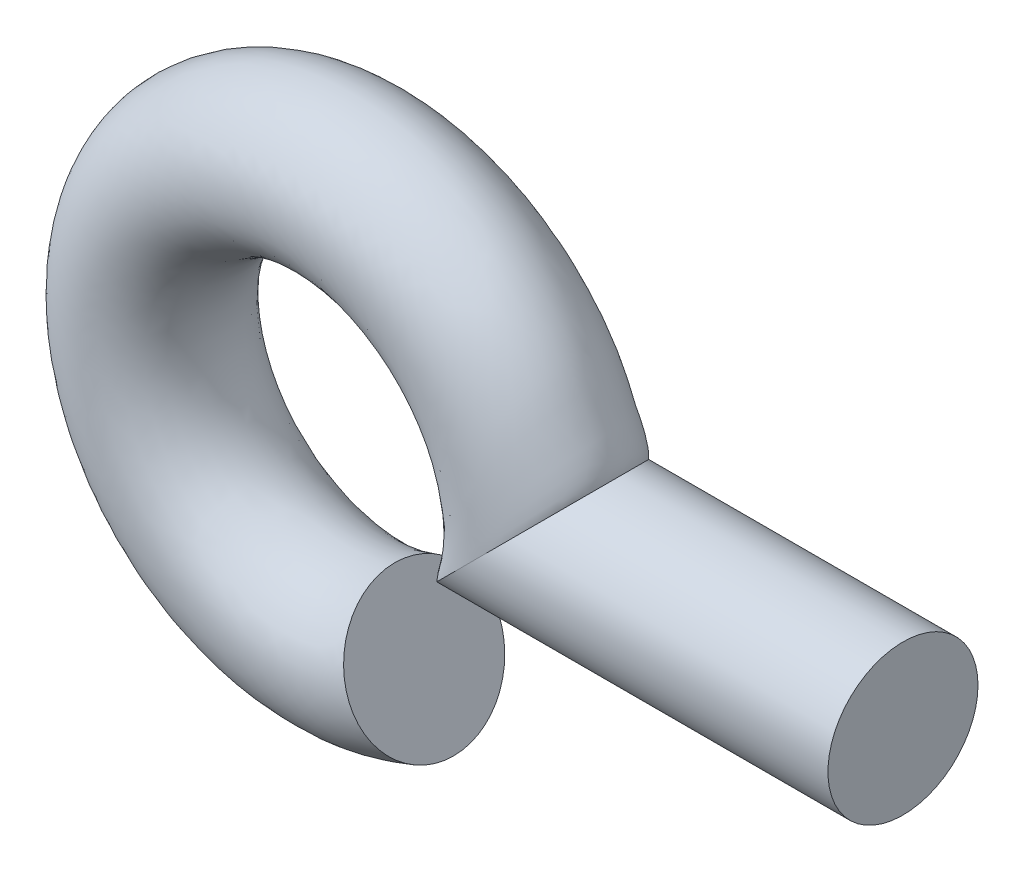
ISO-10303-21;
HEADER;
FILE_DESCRIPTION(('STEP AP214'),'2;1');
FILE_NAME('part.step','',(''),(''),'','','');
FILE_SCHEMA(('AUTOMOTIVE_DESIGN { 1 0 10303 214 1 1 1 1 }'));
ENDSEC;
DATA;
#1=APPLICATION_CONTEXT('core data for automotive mechanical design processes');
#2=APPLICATION_PROTOCOL_DEFINITION('international standard','automotive_design',2000,#1);
#3=PRODUCT_CONTEXT('',#1,'mechanical');
#4=PRODUCT('Part','Part','',(#3));
#5=PRODUCT_RELATED_PRODUCT_CATEGORY('part','',(#4));
#6=PRODUCT_DEFINITION_FORMATION('','',#4);
#7=PRODUCT_DEFINITION_CONTEXT('part definition',#1,'design');
#8=PRODUCT_DEFINITION('design','',#6,#7);
#9=PRODUCT_DEFINITION_SHAPE('','',#8);
#10=(LENGTH_UNIT() NAMED_UNIT(*) SI_UNIT(.MILLI.,.METRE.));
#11=(NAMED_UNIT(*) PLANE_ANGLE_UNIT() SI_UNIT($,.RADIAN.));
#12=(NAMED_UNIT(*) SI_UNIT($,.STERADIAN.) SOLID_ANGLE_UNIT());
#13=UNCERTAINTY_MEASURE_WITH_UNIT(LENGTH_MEASURE(1.E-05),#10,'distance_accuracy_value','');
#14=(GEOMETRIC_REPRESENTATION_CONTEXT(3) GLOBAL_UNCERTAINTY_ASSIGNED_CONTEXT((#13)) GLOBAL_UNIT_ASSIGNED_CONTEXT((#10,
#11,#12)) REPRESENTATION_CONTEXT('',''));
#15=CARTESIAN_POINT('',(0.,0.,0.));
#16=DIRECTION('',(0.,0.,1.));
#17=DIRECTION('',(1.,0.,0.));
#18=AXIS2_PLACEMENT_3D('',#15,#16,#17);
#19=CARTESIAN_POINT('',(12.,0.,0.));
#20=DIRECTION('',(1.,0.,0.));
#21=DIRECTION('',(0.,0.,-1.));
#22=AXIS2_PLACEMENT_3D('',#19,#20,#21);
#23=PLANE('',#22);
#24=CARTESIAN_POINT('',(12.,0.,0.));
#25=DIRECTION('',(1.,0.,0.));
#26=DIRECTION('',(0.,0.,-1.));
#27=AXIS2_PLACEMENT_3D('',#24,#25,#26);
#28=CIRCLE('',#27,2.5);
#29=CARTESIAN_POINT('',(12.,0.,-2.5));
#30=VERTEX_POINT('',#29);
#31=EDGE_CURVE('E11',#30,#30,#28,.T.);
#32=ORIENTED_EDGE('',*,*,#31,.T.);
#33=EDGE_LOOP('',(#32));
#34=FACE_BOUND('',#33,.T.);
#35=ADVANCED_FACE('F37',(#34),#23,.T.);
#36=CARTESIAN_POINT('',(-7.07106781186548,0.,0.));
#37=DIRECTION('',(1.,0.,0.));
#38=DIRECTION('',(0.,0.,-1.));
#39=AXIS2_PLACEMENT_3D('',#36,#37,#38);
#40=CYLINDRICAL_SURFACE('',#39,2.5);
#41=ORIENTED_EDGE('',*,*,#31,.F.);
#42=EDGE_LOOP('',(#41));
#43=FACE_BOUND('',#42,.T.);
#44=CARTESIAN_POINT('',(2.5,2.5,0.));
#45=CARTESIAN_POINT('',(2.5,2.5,5.));
#46=CARTESIAN_POINT('',(-2.5,-2.5,5.));
#47=CARTESIAN_POINT('',(-2.5,-2.5,0.));
#48=CARTESIAN_POINT('',(-2.5,-2.5,-5.));
#49=CARTESIAN_POINT('',(2.5,2.5,-5.));
#50=CARTESIAN_POINT('',(2.5,2.5,0.));
#51=(BOUNDED_CURVE() B_SPLINE_CURVE(3,(#44,#45,#46,#47,#48,#49,#50),.UNSPECIFIED.,.T.,
.F.) B_SPLINE_CURVE_WITH_KNOTS((4,3,4),(0.,0.5,1.),
.UNSPECIFIED.) CURVE() GEOMETRIC_REPRESENTATION_ITEM() RATIONAL_B_SPLINE_CURVE((1.,
0.333333333333333,0.333333333333333,1.,0.333333333333333,0.333333333333333,1.)) REPRESENTATION_ITEM(''));
#52=CARTESIAN_POINT('',(2.5,2.5,0.));
#53=VERTEX_POINT('',#52);
#54=EDGE_CURVE('E48',#53,#53,#51,.T.);
#55=ORIENTED_EDGE('',*,*,#54,.T.);
#56=EDGE_LOOP('',(#55));
#57=FACE_BOUND('',#56,.T.);
#58=ADVANCED_FACE('F39',(#43,#57),#40,.T.);
#59=CARTESIAN_POINT('',(-4.93298784727568,-3.68028163504021,0.));
#60=DIRECTION('',(0.920070408760055,0.391753038181078,0.));
#61=DIRECTION('',(-0.391753038181078,0.920070408760055,0.));
#62=AXIS2_PLACEMENT_3D('',#59,#60,#61);
#63=PLANE('',#62);
#64=CARTESIAN_POINT('',(-3.95360525182299,-5.98045765694035,0.));
#65=DIRECTION('',(0.920070408760055,0.391753038181078,0.));
#66=DIRECTION('',(-0.391753038181078,0.920070408760055,0.));
#67=AXIS2_PLACEMENT_3D('',#64,#65,#66);
#68=CIRCLE('',#67,2.5);
#69=CARTESIAN_POINT('',(-4.93298784727568,-3.68028163504021,0.));
#70=VERTEX_POINT('',#69);
#71=EDGE_CURVE('E44',#70,#70,#68,.T.);
#72=ORIENTED_EDGE('',*,*,#71,.T.);
#73=EDGE_LOOP('',(#72));
#74=FACE_BOUND('',#73,.T.);
#75=ADVANCED_FACE('F64',(#74),#63,.T.);
#76=CARTESIAN_POINT('',(2.5,2.5,0.));
#77=CARTESIAN_POINT('',(2.5,2.89475950581892,0.));
#78=CARTESIAN_POINT('',(1.90990241576345,3.94973628055651,0.));
#79=CARTESIAN_POINT('',(1.1812344819393,5.31187761569296,0.));
#80=CARTESIAN_POINT('',(0.0682495097579176,6.57464731889284,0.));
#81=CARTESIAN_POINT('',(-1.15269438158939,7.55391297272334,0.));
#82=CARTESIAN_POINT('',(-2.46597167611315,8.31066758194399,0.));
#83=CARTESIAN_POINT('',(-3.93451710265803,8.85225911541262,0.));
#84=CARTESIAN_POINT('',(-5.5009167034732,9.14652674591902,0.));
#85=CARTESIAN_POINT('',(-7.09589301585379,9.16064219646685,0.));
#86=CARTESIAN_POINT('',(-8.64107868265515,8.91083366468443,0.));
#87=CARTESIAN_POINT('',(-10.0743164373889,8.41676760681845,0.));
#88=CARTESIAN_POINT('',(-11.4629911428594,7.67420836515801,0.));
#89=CARTESIAN_POINT('',(-12.7592183274868,6.65282383707631,0.));
#90=CARTESIAN_POINT('',(-13.8268062339001,5.41808276990132,0.));
#91=CARTESIAN_POINT('',(-14.613812170436,4.11845435900815,0.));
#92=CARTESIAN_POINT('',(-15.1792574801531,2.70777078086671,0.));
#93=CARTESIAN_POINT('',(-15.528967746368,1.11400434718507,0.));
#94=CARTESIAN_POINT('',(-15.56919295285,-0.535137727086722,0.));
#95=CARTESIAN_POINT('',(-15.3225319807444,-2.09336085998695,0.));
#96=CARTESIAN_POINT('',(-14.8505897461861,-3.53458663418354,0.));
#97=CARTESIAN_POINT('',(-14.1127278968377,-4.91706434969239,0.));
#98=CARTESIAN_POINT('',(-13.1321364816509,-6.17517046431138,0.));
#99=CARTESIAN_POINT('',(-11.9413468109297,-7.2372540631433,0.));
#100=CARTESIAN_POINT('',(-10.6110605746738,-8.06475559316895,0.));
#101=CARTESIAN_POINT('',(-9.20199083698489,-8.62975169166146,0.));
#102=CARTESIAN_POINT('',(-7.66699147330316,-8.97806980208004,0.));
#103=CARTESIAN_POINT('',(-5.99805552506189,-9.03553078507407,0.));
#104=CARTESIAN_POINT('',(-4.45892811541874,-8.82041549558491,0.));
#105=CARTESIAN_POINT('',(-3.31303239661985,-8.42489410048254,0.));
#106=CARTESIAN_POINT('',(-2.97422265637029,-8.28063367884048,0.));
#107=CARTESIAN_POINT('',(2.5,2.5,5.));
#108=CARTESIAN_POINT('',(2.5,2.62438476840025,5.));
#109=CARTESIAN_POINT('',(1.90990241576345,4.08866577919571,5.));
#110=CARTESIAN_POINT('',(1.1812344819393,5.26870352023365,5.));
#111=CARTESIAN_POINT('',(0.0682495097579139,6.58405250463993,5.));
#112=CARTESIAN_POINT('',(-1.15269438158938,7.55151725557083,5.));
#113=CARTESIAN_POINT('',(-2.46597167611319,8.31134334991797,5.));
#114=CARTESIAN_POINT('',(-3.93451710265786,8.85207297150098,5.));
#115=CARTESIAN_POINT('',(-5.50091670347383,9.14657675414134,5.));
#116=CARTESIAN_POINT('',(-7.09589301585143,9.1606290891236,5.));
#117=CARTESIAN_POINT('',(-8.64107868266361,8.91083701084954,5.));
#118=CARTESIAN_POINT('',(-10.0743164373592,8.41676677774818,5.));
#119=CARTESIAN_POINT('',(-11.4629911429747,7.67420864084269,5.));
#120=CARTESIAN_POINT('',(-12.7592183269632,6.65282376483286,5.));
#121=CARTESIAN_POINT('',(-13.8268062355689,5.41808278569591,5.));
#122=CARTESIAN_POINT('',(-14.6138121649012,4.11845435716853,5.));
#123=CARTESIAN_POINT('',(-15.179257501806,2.70777077290587,5.));
#124=CARTESIAN_POINT('',(-15.5289676518181,1.11400438705038,5.));
#125=CARTESIAN_POINT('',(-15.5691933107073,-0.535137879371267,5.));
#126=CARTESIAN_POINT('',(-15.3225309101397,-2.09336040416056,5.));
#127=CARTESIAN_POINT('',(-14.8505940423996,-3.53458846344458,5.));
#128=CARTESIAN_POINT('',(-14.1127111670368,-4.91705722638022,5.));
#129=CARTESIAN_POINT('',(-13.1321999321144,-6.17519748062578,5.));
#130=CARTESIAN_POINT('',(-11.9411120839,-7.23715411967588,5.));
#131=CARTESIAN_POINT('',(-10.6119074725751,-8.06511619038266,5.));
#132=CARTESIAN_POINT('',(-9.19900757958506,-8.62848146262363,5.));
#133=CARTESIAN_POINT('',(-7.6786115593851,-8.98301747128359,5.));
#134=CARTESIAN_POINT('',(-5.94518840776592,-9.01302071016743,5.));
#135=CARTESIAN_POINT('',(-4.62800869523459,-8.89240762815393,5.));
#136=CARTESIAN_POINT('',(-2.98578878510106,-8.28555837376288,5.));
#137=CARTESIAN_POINT('',(-2.97422265637029,-8.28063367884048,5.));
#138=CARTESIAN_POINT('',(-2.5,-2.5,5.));
#139=CARTESIAN_POINT('',(-2.5,-2.37561523159975,5.));
#140=CARTESIAN_POINT('',(-2.04402331574679,-1.55112054644849,5.));
#141=CARTESIAN_POINT('',(-1.95901358043147,-0.673071818593311,5.));
#142=CARTESIAN_POINT('',(-1.93936553145095,0.301281801566885,5.));
#143=CARTESIAN_POINT('',(-2.17802697052505,1.22672815492855,5.));
#144=CARTESIAN_POINT('',(-2.54096890494662,2.03220709875459,5.));
#145=CARTESIAN_POINT('',(-3.06863796928563,2.76059390531848,5.));
#146=CARTESIAN_POINT('',(-3.73010180691181,3.37490362676867,5.));
#147=CARTESIAN_POINT('',(-4.49471829445622,3.83310159135277,5.));
#148=CARTESIAN_POINT('',(-5.3152793499564,4.12523664736621,5.));
#149=CARTESIAN_POINT('',(-6.14150083648918,4.24363397211681,5.));
#150=CARTESIAN_POINT('',(-7.0232475601009,4.19696117799049,5.));
#151=CARTESIAN_POINT('',(-7.85330932925386,3.99028805344062,5.));
#152=CARTESIAN_POINT('',(-8.63819081359457,3.59170162558915,5.));
#153=CARTESIAN_POINT('',(-9.28305636631186,3.0877350000511,5.));
#154=CARTESIAN_POINT('',(-9.8167079254026,2.47473810913115,5.));
#155=CARTESIAN_POINT('',(-10.2445404722457,1.72555656883067,5.));
#156=CARTESIAN_POINT('',(-10.5023280571819,0.936076898819393,5.));
#157=CARTESIAN_POINT('',(-10.5863348338599,0.0966379298673341,5.));
#158=CARTESIAN_POINT('',(-10.5196644882754,-0.688078531713007,5.));
#159=CARTESIAN_POINT('',(-10.292540444634,-1.46595030422706,5.));
#160=CARTESIAN_POINT('',(-9.91522149462546,-2.19399179889961,5.));
#161=CARTESIAN_POINT('',(-9.39761731750664,-2.82650580452043,5.));
#162=CARTESIAN_POINT('',(-8.77870132411057,-3.33893556537281,5.));
#163=CARTESIAN_POINT('',(-8.09176133443493,-3.70443629235409,5.));
#164=CARTESIAN_POINT('',(-7.31340421307075,-3.95548402844763,5.));
#165=CARTESIAN_POINT('',(-6.46464363505264,-4.01830142567088,5.));
#166=CARTESIAN_POINT('',(-5.78161578148962,-3.98682837958837,5.));
#167=CARTESIAN_POINT('',(-4.94455397600645,-3.68520632996261,5.));
#168=CARTESIAN_POINT('',(-4.93298784727568,-3.68028163504021,5.));
#169=CARTESIAN_POINT('',(-2.5,-2.5,0.));
#170=CARTESIAN_POINT('',(-2.5,-2.24042786289042,0.));
#171=CARTESIAN_POINT('',(-2.04402331574679,-1.62058529576809,0.));
#172=CARTESIAN_POINT('',(-1.95901358043147,-0.651484770863654,0.));
#173=CARTESIAN_POINT('',(-1.93936553145095,0.296579208693344,0.));
#174=CARTESIAN_POINT('',(-2.17802697052506,1.2279260135048,0.));
#175=CARTESIAN_POINT('',(-2.5409689049466,2.0318692147676,0.));
#176=CARTESIAN_POINT('',(-3.06863796928571,2.7606869772743,0.));
#177=CARTESIAN_POINT('',(-3.73010180691149,3.37487862265751,0.));
#178=CARTESIAN_POINT('',(-4.4947182944574,3.8331081450244,0.));
#179=CARTESIAN_POINT('',(-5.31527934995217,4.12523497428365,0.));
#180=CARTESIAN_POINT('',(-6.14150083650403,4.24363438665195,0.));
#181=CARTESIAN_POINT('',(-7.02324756004322,4.19696104014815,0.));
#182=CARTESIAN_POINT('',(-7.85330932951562,3.99028808956235,0.));
#183=CARTESIAN_POINT('',(-8.63819081276018,3.59170161769185,0.));
#184=CARTESIAN_POINT('',(-9.28305636907925,3.08773500097091,0.));
#185=CARTESIAN_POINT('',(-9.81670791457619,2.47473811311157,0.));
#186=CARTESIAN_POINT('',(-10.2445405195207,1.72555654889802,0.));
#187=CARTESIAN_POINT('',(-10.5023278782533,0.936076974961665,0.));
#188=CARTESIAN_POINT('',(-10.5863353691622,0.0966377019541395,0.));
#189=CARTESIAN_POINT('',(-10.5196623401686,-0.688077617082487,0.));
#190=CARTESIAN_POINT('',(-10.2925488095344,-1.46595386588315,0.));
#191=CARTESIAN_POINT('',(-9.91518976939369,-2.1939782907424,0.));
#192=CARTESIAN_POINT('',(-9.39773468102149,-2.82655577625414,0.));
#193=CARTESIAN_POINT('',(-8.77827787515994,-3.33875526676596,0.));
#194=CARTESIAN_POINT('',(-8.09325296313484,-3.70507140687301,0.));
#195=CARTESIAN_POINT('',(-7.30759417002978,-3.95301019384585,0.));
#196=CARTESIAN_POINT('',(-6.49107719370062,-4.0295564631242,0.));
#197=CARTESIAN_POINT('',(-5.69707549158169,-3.95083231330386,0.));
#198=CARTESIAN_POINT('',(-5.10817578176585,-3.75487419332244,0.));
#199=CARTESIAN_POINT('',(-4.93298784727568,-3.68028163504021,0.));
#200=CARTESIAN_POINT('',(-2.5,-2.5,-5.));
#201=CARTESIAN_POINT('',(-2.5,-2.10524049418108,-5.));
#202=CARTESIAN_POINT('',(-2.04402331574679,-1.69005004508768,-5.));
#203=CARTESIAN_POINT('',(-1.95901358043147,-0.629897723133999,-5.));
#204=CARTESIAN_POINT('',(-1.93936553145095,0.291876615819804,-5.));
#205=CARTESIAN_POINT('',(-2.17802697052506,1.22912387208105,-5.));
#206=CARTESIAN_POINT('',(-2.54096890494657,2.03153133078061,-5.));
#207=CARTESIAN_POINT('',(-3.0686379692858,2.76078004923012,-5.));
#208=CARTESIAN_POINT('',(-3.73010180691117,3.37485361854635,-5.));
#209=CARTESIAN_POINT('',(-4.49471829445857,3.83311469869602,-5.));
#210=CARTESIAN_POINT('',(-5.31527934994794,4.1252333012011,-5.));
#211=CARTESIAN_POINT('',(-6.14150083651888,4.24363480118708,-5.));
#212=CARTESIAN_POINT('',(-7.02324755998555,4.19696090230581,-5.));
#213=CARTESIAN_POINT('',(-7.85330932977738,3.99028812568407,-5.));
#214=CARTESIAN_POINT('',(-8.63819081192579,3.59170160979456,-5.));
#215=CARTESIAN_POINT('',(-9.28305637184664,3.08773500189072,-5.));
#216=CARTESIAN_POINT('',(-9.81670790374978,2.47473811709199,-5.));
#217=CARTESIAN_POINT('',(-10.2445405667956,1.72555652896537,-5.));
#218=CARTESIAN_POINT('',(-10.5023276993246,0.936077051103936,-5.));
#219=CARTESIAN_POINT('',(-10.5863359044646,0.0966374740409476,-5.));
#220=CARTESIAN_POINT('',(-10.5196601920619,-0.688076702451969,-5.));
#221=CARTESIAN_POINT('',(-10.2925571744348,-1.46595742753923,-5.));
#222=CARTESIAN_POINT('',(-9.91515804416192,-2.1939647825852,-5.));
#223=CARTESIAN_POINT('',(-9.39785204453635,-2.82660574798785,-5.));
#224=CARTESIAN_POINT('',(-8.77785442620932,-3.3385749681591,-5.));
#225=CARTESIAN_POINT('',(-8.09474459183475,-3.70570652139192,-5.));
#226=CARTESIAN_POINT('',(-7.30178412698881,-3.95053635924408,-5.));
#227=CARTESIAN_POINT('',(-6.51751075234861,-4.04081150057752,-5.));
#228=CARTESIAN_POINT('',(-5.61253520167377,-3.91483624701936,-5.));
#229=CARTESIAN_POINT('',(-5.27179758752524,-3.82454205668227,-5.));
#230=CARTESIAN_POINT('',(-4.93298784727568,-3.68028163504021,-5.));
#231=CARTESIAN_POINT('',(2.5,2.5,-5.));
#232=CARTESIAN_POINT('',(2.5,3.16513424323758,-5.));
#233=CARTESIAN_POINT('',(1.90990241576345,3.81080678191731,-5.));
#234=CARTESIAN_POINT('',(1.1812344819393,5.35505171115228,-5.));
#235=CARTESIAN_POINT('',(0.0682495097579212,6.56524213314576,-5.));
#236=CARTESIAN_POINT('',(-1.1526943815894,7.55630868987583,-5.));
#237=CARTESIAN_POINT('',(-2.46597167611311,8.30999181397002,-5.));
#238=CARTESIAN_POINT('',(-3.9345171026582,8.85244525932427,-5.));
#239=CARTESIAN_POINT('',(-5.50091670347256,9.14647673769669,-5.));
#240=CARTESIAN_POINT('',(-7.09589301585614,9.1606553038101,-5.));
#241=CARTESIAN_POINT('',(-8.64107868264669,8.91083031851932,-5.));
#242=CARTESIAN_POINT('',(-10.0743164374186,8.41676843588873,-5.));
#243=CARTESIAN_POINT('',(-11.4629911427441,7.67420808947333,-5.));
#244=CARTESIAN_POINT('',(-12.7592183280103,6.65282390931976,-5.));
#245=CARTESIAN_POINT('',(-13.8268062322314,5.41808275410673,-5.));
#246=CARTESIAN_POINT('',(-14.6138121759708,4.11845436084777,-5.));
#247=CARTESIAN_POINT('',(-15.1792574585003,2.70777078882755,-5.));
#248=CARTESIAN_POINT('',(-15.5289678409178,1.11400430731977,-5.));
#249=CARTESIAN_POINT('',(-15.5691925949926,-0.535137574802179,-5.));
#250=CARTESIAN_POINT('',(-15.3225330513491,-2.09336131581334,-5.));
#251=CARTESIAN_POINT('',(-14.8505854499726,-3.5345848049225,-5.));
#252=CARTESIAN_POINT('',(-14.1127446266386,-4.91707147300456,-5.));
#253=CARTESIAN_POINT('',(-13.1320730311873,-6.17514344799697,-5.));
#254=CARTESIAN_POINT('',(-11.9415815379594,-7.23735400661072,-5.));
#255=CARTESIAN_POINT('',(-10.6102136767726,-8.06439499595524,-5.));
#256=CARTESIAN_POINT('',(-9.20497409438471,-8.63102192069928,-5.));
#257=CARTESIAN_POINT('',(-7.65537138722122,-8.97312213287649,-5.));
#258=CARTESIAN_POINT('',(-6.05092264235786,-9.05804085998071,-5.));
#259=CARTESIAN_POINT('',(-4.28984753560289,-8.74842336301591,-5.));
#260=CARTESIAN_POINT('',(-3.64027600813865,-8.5642298272022,-5.));
#261=CARTESIAN_POINT('',(-2.97422265637029,-8.28063367884048,-5.));
#262=CARTESIAN_POINT('',(2.5,2.5,0.));
#263=CARTESIAN_POINT('',(2.5,2.89475950581892,0.));
#264=CARTESIAN_POINT('',(1.90990241576345,3.94973628055651,0.));
#265=CARTESIAN_POINT('',(1.1812344819393,5.31187761569296,0.));
#266=CARTESIAN_POINT('',(0.0682495097579176,6.57464731889284,0.));
#267=CARTESIAN_POINT('',(-1.15269438158939,7.55391297272334,0.));
#268=CARTESIAN_POINT('',(-2.46597167611315,8.31066758194399,0.));
#269=CARTESIAN_POINT('',(-3.93451710265803,8.85225911541262,0.));
#270=CARTESIAN_POINT('',(-5.5009167034732,9.14652674591902,0.));
#271=CARTESIAN_POINT('',(-7.09589301585379,9.16064219646685,0.));
#272=CARTESIAN_POINT('',(-8.64107868265515,8.91083366468443,0.));
#273=CARTESIAN_POINT('',(-10.0743164373889,8.41676760681845,0.));
#274=CARTESIAN_POINT('',(-11.4629911428594,7.67420836515801,0.));
#275=CARTESIAN_POINT('',(-12.7592183274868,6.65282383707631,0.));
#276=CARTESIAN_POINT('',(-13.8268062339001,5.41808276990132,0.));
#277=CARTESIAN_POINT('',(-14.613812170436,4.11845435900815,0.));
#278=CARTESIAN_POINT('',(-15.1792574801531,2.70777078086671,0.));
#279=CARTESIAN_POINT('',(-15.528967746368,1.11400434718507,0.));
#280=CARTESIAN_POINT('',(-15.56919295285,-0.535137727086722,0.));
#281=CARTESIAN_POINT('',(-15.3225319807444,-2.09336085998695,0.));
#282=CARTESIAN_POINT('',(-14.8505897461861,-3.53458663418354,0.));
#283=CARTESIAN_POINT('',(-14.1127278968377,-4.91706434969239,0.));
#284=CARTESIAN_POINT('',(-13.1321364816509,-6.17517046431138,0.));
#285=CARTESIAN_POINT('',(-11.9413468109297,-7.2372540631433,0.));
#286=CARTESIAN_POINT('',(-10.6110605746738,-8.06475559316895,0.));
#287=CARTESIAN_POINT('',(-9.20199083698489,-8.62975169166146,0.));
#288=CARTESIAN_POINT('',(-7.66699147330316,-8.97806980208004,0.));
#289=CARTESIAN_POINT('',(-5.99805552506189,-9.03553078507407,0.));
#290=CARTESIAN_POINT('',(-4.45892811541874,-8.82041549558491,0.));
#291=CARTESIAN_POINT('',(-3.31303239661985,-8.42489410048254,0.));
#292=CARTESIAN_POINT('',(-2.97422265637029,-8.28063367884048,0.));
#293=(BOUNDED_SURFACE() B_SPLINE_SURFACE(3,3,((#76,#77,#78,#79,#80,#81,#82,#83,#84,#85,#86,#87,
#88,#89,#90,#91,#92,#93,#94,#95,#96,#97,#98,#99,#100,#101,#102,#103,#104,#105,#106),(#107,#108,
#109,#110,#111,#112,#113,#114,#115,#116,#117,#118,#119,#120,#121,#122,#123,#124,#125,#126,#127,
#128,#129,#130,#131,#132,#133,#134,#135,#136,#137),(#138,#139,#140,#141,#142,#143,#144,#145,
#146,#147,#148,#149,#150,#151,#152,#153,#154,#155,#156,#157,#158,#159,#160,#161,#162,#163,#164,
#165,#166,#167,#168),(#169,#170,#171,#172,#173,#174,#175,#176,#177,#178,#179,#180,#181,#182,
#183,#184,#185,#186,#187,#188,#189,#190,#191,#192,#193,#194,#195,#196,#197,#198,#199),(#200,
#201,#202,#203,#204,#205,#206,#207,#208,#209,#210,#211,#212,#213,#214,#215,#216,#217,#218,#219,
#220,#221,#222,#223,#224,#225,#226,#227,#228,#229,#230),(#231,#232,#233,#234,#235,#236,#237,
#238,#239,#240,#241,#242,#243,#244,#245,#246,#247,#248,#249,#250,#251,#252,#253,#254,#255,#256,
#257,#258,#259,#260,#261),(#262,#263,#264,#265,#266,#267,#268,#269,#270,#271,#272,#273,#274,
#275,#276,#277,#278,#279,#280,#281,#282,#283,#284,#285,#286,#287,#288,#289,#290,#291,#292)),
.UNSPECIFIED.,.T.,.F.,.F.) B_SPLINE_SURFACE_WITH_KNOTS((4,3,4),(4,1,1,1,1,1,1,1,1,1,1,1,1,1,1,1,
1,1,1,1,1,1,1,1,1,1,1,1,4),(0.,0.5,1.),(0.,0.034592246671068,0.0728374520206067,
0.11470312667925,0.148350754367359,0.183487718109722,0.219706953492329,0.256409976492874,
0.292990633795848,0.328856311458193,0.363419565351918,0.39630410759178,0.436888814614705,
0.473733603172805,0.506818648266755,0.539845127112896,0.576497650599404,0.61671590837465,
0.649198910474168,0.683213369794155,0.718371484615373,0.75409100171341,0.789782066136926,
0.824859349476375,0.858742048877756,0.891050652684041,0.93097776547019,0.967313258211219,1.),
.UNSPECIFIED.) GEOMETRIC_REPRESENTATION_ITEM() RATIONAL_B_SPLINE_SURFACE(((1.,1.,1.,1.,1.,1.,1.,
1.,1.,1.,1.,1.,1.,1.,1.,1.,1.,1.,1.,1.,1.,1.,1.,1.,1.,1.,1.,1.,1.,1.,1.),(0.333333333333333,
0.333333333333333,0.333333333333333,0.333333333333333,0.333333333333333,0.333333333333333,
0.333333333333333,0.333333333333333,0.333333333333333,0.333333333333333,0.333333333333333,
0.333333333333333,0.333333333333333,0.333333333333333,0.333333333333333,0.333333333333333,
0.333333333333333,0.333333333333333,0.333333333333333,0.333333333333333,0.333333333333333,
0.333333333333333,0.333333333333333,0.333333333333333,0.333333333333333,0.333333333333333,
0.333333333333333,0.333333333333333,0.333333333333333,0.333333333333333,0.333333333333333),
(0.333333333333333,0.333333333333333,0.333333333333333,0.333333333333333,0.333333333333333,
0.333333333333333,0.333333333333333,0.333333333333333,0.333333333333333,0.333333333333333,
0.333333333333333,0.333333333333333,0.333333333333333,0.333333333333333,0.333333333333333,
0.333333333333333,0.333333333333333,0.333333333333333,0.333333333333333,0.333333333333333,
0.333333333333333,0.333333333333333,0.333333333333333,0.333333333333333,0.333333333333333,
0.333333333333333,0.333333333333333,0.333333333333333,0.333333333333333,0.333333333333333,
0.333333333333333),(1.,1.,1.,1.,1.,1.,1.,1.,1.,1.,1.,1.,1.,1.,1.,1.,1.,1.,1.,1.,1.,1.,1.,1.,1.,
1.,1.,1.,1.,1.,1.),(0.333333333333333,0.333333333333333,0.333333333333333,0.333333333333333,
0.333333333333333,0.333333333333333,0.333333333333333,0.333333333333333,0.333333333333333,
0.333333333333333,0.333333333333333,0.333333333333333,0.333333333333333,0.333333333333333,
0.333333333333333,0.333333333333333,0.333333333333333,0.333333333333333,0.333333333333333,
0.333333333333333,0.333333333333333,0.333333333333333,0.333333333333333,0.333333333333333,
0.333333333333333,0.333333333333333,0.333333333333333,0.333333333333333,0.333333333333333,
0.333333333333333,0.333333333333333),(0.333333333333333,0.333333333333333,0.333333333333333,
0.333333333333333,0.333333333333333,0.333333333333333,0.333333333333333,0.333333333333333,
0.333333333333333,0.333333333333333,0.333333333333333,0.333333333333333,0.333333333333333,
0.333333333333333,0.333333333333333,0.333333333333333,0.333333333333333,0.333333333333333,
0.333333333333333,0.333333333333333,0.333333333333333,0.333333333333333,0.333333333333333,
0.333333333333333,0.333333333333333,0.333333333333333,0.333333333333333,0.333333333333333,
0.333333333333333,0.333333333333333,0.333333333333333),(1.,1.,1.,1.,1.,1.,1.,1.,1.,1.,1.,1.,1.,
1.,1.,1.,1.,1.,1.,1.,1.,1.,1.,1.,1.,1.,1.,1.,1.,1.,1.))) REPRESENTATION_ITEM('') SURFACE());
#294=ORIENTED_EDGE('',*,*,#54,.F.);
#295=EDGE_LOOP('',(#294));
#296=FACE_BOUND('',#295,.T.);
#297=ORIENTED_EDGE('',*,*,#71,.F.);
#298=EDGE_LOOP('',(#297));
#299=FACE_BOUND('',#298,.T.);
#300=ADVANCED_FACE('F61',(#296,#299),#293,.F.);
#301=CLOSED_SHELL('',(#35,#58,#75,#300));
#302=MANIFOLD_SOLID_BREP('B2',#301);
#303=ADVANCED_BREP_SHAPE_REPRESENTATION('',(#18,#302),#14);
#304=SHAPE_DEFINITION_REPRESENTATION(#9,#303);
ENDSEC;
END-ISO-10303-21;
